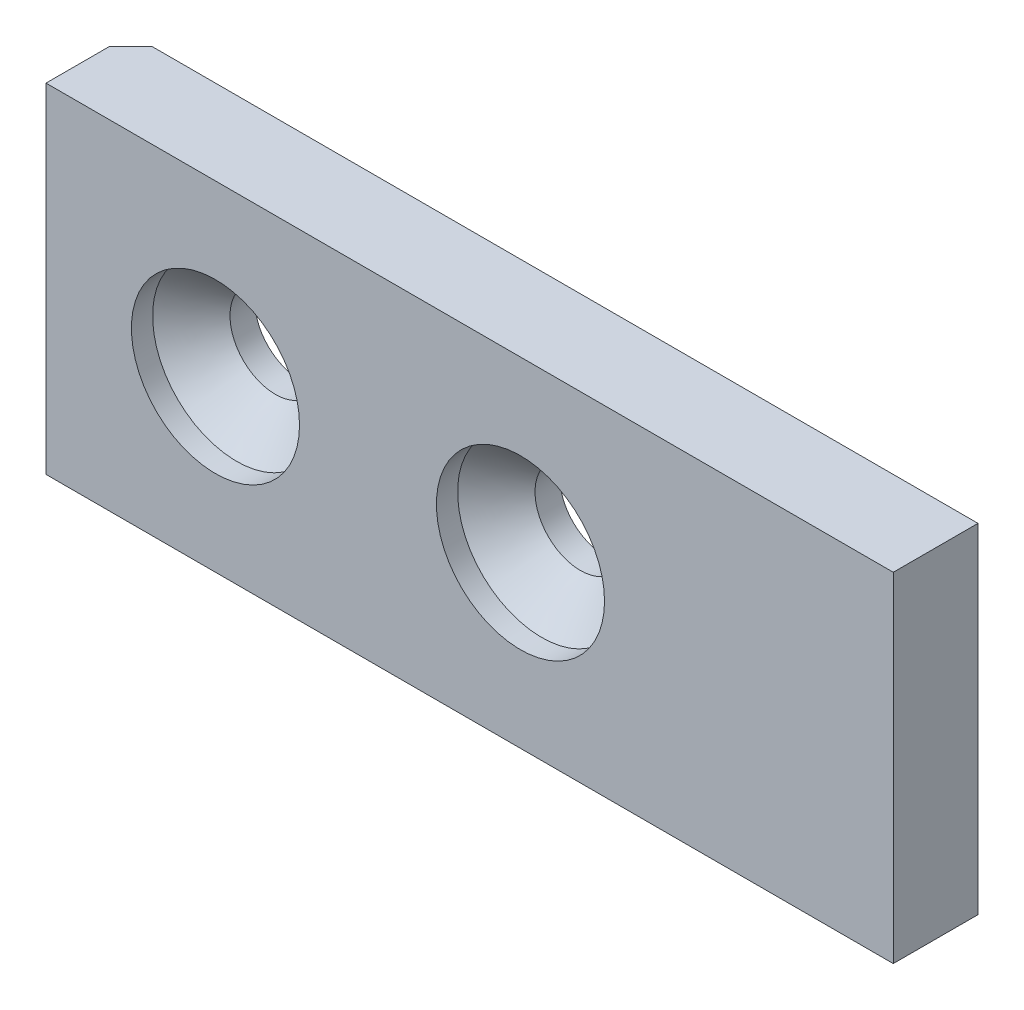
ISO-10303-21;
HEADER;
FILE_DESCRIPTION(('STEP AP214'),'2;1');
FILE_NAME('part.step','',(''),(''),'','','');
FILE_SCHEMA(('AUTOMOTIVE_DESIGN { 1 0 10303 214 1 1 1 1 }'));
ENDSEC;
DATA;
#1=APPLICATION_CONTEXT('core data for automotive mechanical design processes');
#2=APPLICATION_PROTOCOL_DEFINITION('international standard','automotive_design',2000,#1);
#3=PRODUCT_CONTEXT('',#1,'mechanical');
#4=PRODUCT('Part','Part','',(#3));
#5=PRODUCT_RELATED_PRODUCT_CATEGORY('part','',(#4));
#6=PRODUCT_DEFINITION_FORMATION('','',#4);
#7=PRODUCT_DEFINITION_CONTEXT('part definition',#1,'design');
#8=PRODUCT_DEFINITION('design','',#6,#7);
#9=PRODUCT_DEFINITION_SHAPE('','',#8);
#10=(LENGTH_UNIT() NAMED_UNIT(*) SI_UNIT(.MILLI.,.METRE.));
#11=(NAMED_UNIT(*) PLANE_ANGLE_UNIT() SI_UNIT($,.RADIAN.));
#12=(NAMED_UNIT(*) SI_UNIT($,.STERADIAN.) SOLID_ANGLE_UNIT());
#13=UNCERTAINTY_MEASURE_WITH_UNIT(LENGTH_MEASURE(1.E-05),#10,'distance_accuracy_value','');
#14=(GEOMETRIC_REPRESENTATION_CONTEXT(3) GLOBAL_UNCERTAINTY_ASSIGNED_CONTEXT((#13)) GLOBAL_UNIT_ASSIGNED_CONTEXT((#10,
#11,#12)) REPRESENTATION_CONTEXT('',''));
#15=CARTESIAN_POINT('',(0.,0.,0.));
#16=DIRECTION('',(0.,0.,1.));
#17=DIRECTION('',(1.,0.,0.));
#18=AXIS2_PLACEMENT_3D('',#15,#16,#17);
#19=CARTESIAN_POINT('',(-15.8750000000003,6.35,3.17500000000004));
#20=DIRECTION('',(1.,0.,0.));
#21=DIRECTION('',(0.,0.,-1.));
#22=AXIS2_PLACEMENT_3D('',#19,#20,#21);
#23=PLANE('',#22);
#24=DIRECTION('',(0.,0.707106781186548,0.707106781186547));
#25=VECTOR('',#24,1.);
#26=CARTESIAN_POINT('',(-15.8750000000003,7.540625,1.98437500000004));
#27=LINE('',#26,#25);
#28=CARTESIAN_POINT('',(-15.8750000000003,5.55625,0.));
#29=VERTEX_POINT('',#28);
#30=CARTESIAN_POINT('',(-15.8750000000003,6.35,0.793750000000037));
#31=VERTEX_POINT('',#30);
#32=EDGE_CURVE('E113',#29,#31,#27,.T.);
#33=ORIENTED_EDGE('',*,*,#32,.F.);
#34=DIRECTION('',(0.,-1.,0.));
#35=VECTOR('',#34,1.);
#36=CARTESIAN_POINT('',(-15.8750000000003,6.35,0.));
#37=LINE('',#36,#35);
#38=CARTESIAN_POINT('',(-15.8750000000003,-6.35,0.));
#39=VERTEX_POINT('',#38);
#40=EDGE_CURVE('E102',#29,#39,#37,.T.);
#41=ORIENTED_EDGE('',*,*,#40,.T.);
#42=DIRECTION('',(0.,0.,-1.));
#43=VECTOR('',#42,1.);
#44=CARTESIAN_POINT('',(-15.8750000000003,-6.35,3.17500000000004));
#45=LINE('',#44,#43);
#46=CARTESIAN_POINT('',(-15.8750000000003,-6.35,3.17500000000004));
#47=VERTEX_POINT('',#46);
#48=EDGE_CURVE('E117',#47,#39,#45,.T.);
#49=ORIENTED_EDGE('',*,*,#48,.F.);
#50=DIRECTION('',(0.,-1.,0.));
#51=VECTOR('',#50,1.);
#52=CARTESIAN_POINT('',(-15.8750000000003,6.35,3.17500000000004));
#53=LINE('',#52,#51);
#54=CARTESIAN_POINT('',(-15.8750000000003,6.35,3.17500000000004));
#55=VERTEX_POINT('',#54);
#56=EDGE_CURVE('E132',#55,#47,#53,.T.);
#57=ORIENTED_EDGE('',*,*,#56,.F.);
#58=DIRECTION('',(0.,0.,-1.));
#59=VECTOR('',#58,1.);
#60=CARTESIAN_POINT('',(-15.8750000000003,6.35,3.17500000000004));
#61=LINE('',#60,#59);
#62=EDGE_CURVE('E115',#55,#31,#61,.T.);
#63=ORIENTED_EDGE('',*,*,#62,.T.);
#64=EDGE_LOOP('',(#33,#41,#49,#57,#63));
#65=FACE_BOUND('',#64,.T.);
#66=ADVANCED_FACE('F59',(#65),#23,.F.);
#67=CARTESIAN_POINT('',(-15.8750000000003,-6.35,3.17500000000004));
#68=DIRECTION('',(0.,1.,0.));
#69=DIRECTION('',(0.,0.,1.));
#70=AXIS2_PLACEMENT_3D('',#67,#68,#69);
#71=PLANE('',#70);
#72=DIRECTION('',(1.,0.,0.));
#73=VECTOR('',#72,1.);
#74=CARTESIAN_POINT('',(-15.8750000000003,-6.35,0.));
#75=LINE('',#74,#73);
#76=CARTESIAN_POINT('',(15.8750000000003,-6.35,0.));
#77=VERTEX_POINT('',#76);
#78=EDGE_CURVE('E106',#39,#77,#75,.T.);
#79=ORIENTED_EDGE('',*,*,#78,.T.);
#80=DIRECTION('',(0.,0.,-1.));
#81=VECTOR('',#80,1.);
#82=CARTESIAN_POINT('',(15.8750000000003,-6.35,3.17500000000004));
#83=LINE('',#82,#81);
#84=CARTESIAN_POINT('',(15.8750000000003,-6.35,3.17500000000004));
#85=VERTEX_POINT('',#84);
#86=EDGE_CURVE('E122',#85,#77,#83,.T.);
#87=ORIENTED_EDGE('',*,*,#86,.F.);
#88=DIRECTION('',(1.,0.,0.));
#89=VECTOR('',#88,1.);
#90=CARTESIAN_POINT('',(-15.8750000000003,-6.35,3.17500000000004));
#91=LINE('',#90,#89);
#92=EDGE_CURVE('E139',#47,#85,#91,.T.);
#93=ORIENTED_EDGE('',*,*,#92,.F.);
#94=ORIENTED_EDGE('',*,*,#48,.T.);
#95=EDGE_LOOP('',(#79,#87,#93,#94));
#96=FACE_BOUND('',#95,.T.);
#97=ADVANCED_FACE('F179',(#96),#71,.F.);
#98=CARTESIAN_POINT('',(15.8750000000003,6.35,3.17500000000004));
#99=DIRECTION('',(-1.,0.,0.));
#100=DIRECTION('',(0.,0.,1.));
#101=AXIS2_PLACEMENT_3D('',#98,#99,#100);
#102=PLANE('',#101);
#103=DIRECTION('',(0.,1.,0.));
#104=VECTOR('',#103,1.);
#105=CARTESIAN_POINT('',(15.8750000000003,6.35,0.));
#106=LINE('',#105,#104);
#107=CARTESIAN_POINT('',(15.8750000000003,6.35,0.));
#108=VERTEX_POINT('',#107);
#109=EDGE_CURVE('E133',#77,#108,#106,.T.);
#110=ORIENTED_EDGE('',*,*,#109,.T.);
#111=DIRECTION('',(0.,0.,-1.));
#112=VECTOR('',#111,1.);
#113=CARTESIAN_POINT('',(15.8750000000003,6.35,3.17500000000004));
#114=LINE('',#113,#112);
#115=CARTESIAN_POINT('',(15.8750000000003,6.35,3.17500000000004));
#116=VERTEX_POINT('',#115);
#117=EDGE_CURVE('E125',#116,#108,#114,.T.);
#118=ORIENTED_EDGE('',*,*,#117,.F.);
#119=DIRECTION('',(0.,1.,0.));
#120=VECTOR('',#119,1.);
#121=CARTESIAN_POINT('',(15.8750000000003,6.35,3.17500000000004));
#122=LINE('',#121,#120);
#123=EDGE_CURVE('E137',#85,#116,#122,.T.);
#124=ORIENTED_EDGE('',*,*,#123,.F.);
#125=ORIENTED_EDGE('',*,*,#86,.T.);
#126=EDGE_LOOP('',(#110,#118,#124,#125));
#127=FACE_BOUND('',#126,.T.);
#128=ADVANCED_FACE('F183',(#127),#102,.F.);
#129=CARTESIAN_POINT('',(-15.8750000000003,6.35,3.17500000000004));
#130=DIRECTION('',(0.,-1.,0.));
#131=DIRECTION('',(0.,0.,-1.));
#132=AXIS2_PLACEMENT_3D('',#129,#130,#131);
#133=PLANE('',#132);
#134=DIRECTION('',(0.707106781186547,0.,-0.707106781186548));
#135=VECTOR('',#134,1.);
#136=CARTESIAN_POINT('',(-17.0656249999999,6.35,1.98437500000004));
#137=LINE('',#136,#135);
#138=CARTESIAN_POINT('',(-15.0812499999997,6.35,0.));
#139=VERTEX_POINT('',#138);
#140=EDGE_CURVE('E66',#31,#139,#137,.T.);
#141=ORIENTED_EDGE('',*,*,#140,.F.);
#142=ORIENTED_EDGE('',*,*,#62,.F.);
#143=DIRECTION('',(-1.,0.,0.));
#144=VECTOR('',#143,1.);
#145=CARTESIAN_POINT('',(-15.8750000000003,6.35,3.17500000000004));
#146=LINE('',#145,#144);
#147=EDGE_CURVE('E129',#116,#55,#146,.T.);
#148=ORIENTED_EDGE('',*,*,#147,.F.);
#149=ORIENTED_EDGE('',*,*,#117,.T.);
#150=DIRECTION('',(-1.,0.,0.));
#151=VECTOR('',#150,1.);
#152=CARTESIAN_POINT('',(-15.8750000000003,6.35,0.));
#153=LINE('',#152,#151);
#154=EDGE_CURVE('E130',#108,#139,#153,.T.);
#155=ORIENTED_EDGE('',*,*,#154,.T.);
#156=EDGE_LOOP('',(#141,#142,#148,#149,#155));
#157=FACE_BOUND('',#156,.T.);
#158=ADVANCED_FACE('F172',(#157),#133,.F.);
#159=CARTESIAN_POINT('',(0.,0.,3.17500000000004));
#160=DIRECTION('',(0.,0.,1.));
#161=DIRECTION('',(1.,0.,0.));
#162=AXIS2_PLACEMENT_3D('',#159,#160,#161);
#163=PLANE('',#162);
#164=CARTESIAN_POINT('',(-9.52500000000001,0.,3.17500000000004));
#165=DIRECTION('',(0.,0.,1.));
#166=DIRECTION('',(1.,0.,0.));
#167=AXIS2_PLACEMENT_3D('',#164,#165,#166);
#168=CIRCLE('',#167,3.15);
#169=CARTESIAN_POINT('',(-6.37500000000001,0.,3.17500000000004));
#170=VERTEX_POINT('',#169);
#171=EDGE_CURVE('E163',#170,#170,#168,.T.);
#172=ORIENTED_EDGE('',*,*,#171,.F.);
#173=EDGE_LOOP('',(#172));
#174=FACE_BOUND('',#173,.T.);
#175=CARTESIAN_POINT('',(1.90499999999982,0.,3.17500000000004));
#176=DIRECTION('',(0.,0.,1.));
#177=DIRECTION('',(1.,0.,0.));
#178=AXIS2_PLACEMENT_3D('',#175,#176,#177);
#179=CIRCLE('',#178,3.15);
#180=CARTESIAN_POINT('',(5.05499999999982,0.,3.17500000000004));
#181=VERTEX_POINT('',#180);
#182=EDGE_CURVE('E151',#181,#181,#179,.T.);
#183=ORIENTED_EDGE('',*,*,#182,.F.);
#184=EDGE_LOOP('',(#183));
#185=FACE_BOUND('',#184,.T.);
#186=ORIENTED_EDGE('',*,*,#56,.T.);
#187=ORIENTED_EDGE('',*,*,#92,.T.);
#188=ORIENTED_EDGE('',*,*,#123,.T.);
#189=ORIENTED_EDGE('',*,*,#147,.T.);
#190=EDGE_LOOP('',(#186,#187,#188,#189));
#191=FACE_BOUND('',#190,.T.);
#192=ADVANCED_FACE('F169',(#174,#185,#191),#163,.T.);
#193=CARTESIAN_POINT('',(0.,0.,0.));
#194=DIRECTION('',(0.,0.,1.));
#195=DIRECTION('',(1.,0.,0.));
#196=AXIS2_PLACEMENT_3D('',#193,#194,#195);
#197=PLANE('',#196);
#198=CARTESIAN_POINT('',(-9.52500000000001,0.,0.));
#199=DIRECTION('',(0.,0.,1.));
#200=DIRECTION('',(1.,0.,0.));
#201=AXIS2_PLACEMENT_3D('',#198,#199,#200);
#202=CIRCLE('',#201,1.70000000000001);
#203=CARTESIAN_POINT('',(-7.82499999999999,0.,0.));
#204=VERTEX_POINT('',#203);
#205=EDGE_CURVE('E154',#204,#204,#202,.T.);
#206=ORIENTED_EDGE('',*,*,#205,.T.);
#207=EDGE_LOOP('',(#206));
#208=FACE_BOUND('',#207,.T.);
#209=CARTESIAN_POINT('',(1.90499999999982,0.,0.));
#210=DIRECTION('',(0.,0.,1.));
#211=DIRECTION('',(1.,0.,0.));
#212=AXIS2_PLACEMENT_3D('',#209,#210,#211);
#213=CIRCLE('',#212,1.70000000000001);
#214=CARTESIAN_POINT('',(3.60499999999984,0.,0.));
#215=VERTEX_POINT('',#214);
#216=EDGE_CURVE('E110',#215,#215,#213,.T.);
#217=ORIENTED_EDGE('',*,*,#216,.T.);
#218=EDGE_LOOP('',(#217));
#219=FACE_BOUND('',#218,.T.);
#220=DIRECTION('',(-0.707106781186547,-0.707106781186548,0.));
#221=VECTOR('',#220,1.);
#222=CARTESIAN_POINT('',(-10.7156250000005,10.715625,0.));
#223=LINE('',#222,#221);
#224=EDGE_CURVE('E14',#139,#29,#223,.T.);
#225=ORIENTED_EDGE('',*,*,#224,.F.);
#226=ORIENTED_EDGE('',*,*,#154,.F.);
#227=ORIENTED_EDGE('',*,*,#109,.F.);
#228=ORIENTED_EDGE('',*,*,#78,.F.);
#229=ORIENTED_EDGE('',*,*,#40,.F.);
#230=EDGE_LOOP('',(#225,#226,#227,#228,#229));
#231=FACE_BOUND('',#230,.T.);
#232=ADVANCED_FACE('F104',(#208,#219,#231),#197,.F.);
#233=CARTESIAN_POINT('',(-7.14375,7.14375,-7.14375));
#234=DIRECTION('',(-0.577350269189627,0.577350269189625,-0.577350269189626));
#235=DIRECTION('',(-0.707106781186547,0.,0.707106781186548));
#236=AXIS2_PLACEMENT_3D('',#233,#234,#235);
#237=PLANE('',#236);
#238=ORIENTED_EDGE('',*,*,#224,.T.);
#239=ORIENTED_EDGE('',*,*,#32,.T.);
#240=ORIENTED_EDGE('',*,*,#140,.T.);
#241=EDGE_LOOP('',(#238,#239,#240));
#242=FACE_BOUND('',#241,.T.);
#243=ADVANCED_FACE('F119',(#242),#237,.T.);
#244=CARTESIAN_POINT('',(1.90499999999982,0.,3.17500000000004));
#245=DIRECTION('',(0.,0.,1.));
#246=DIRECTION('',(1.,0.,0.));
#247=AXIS2_PLACEMENT_3D('',#244,#245,#246);
#248=CYLINDRICAL_SURFACE('',#247,1.70000000000001);
#249=ORIENTED_EDGE('',*,*,#216,.F.);
#250=EDGE_LOOP('',(#249));
#251=FACE_BOUND('',#250,.T.);
#252=CARTESIAN_POINT('',(1.90499999999982,0.,0.929979999999997));
#253=DIRECTION('',(0.,0.,1.));
#254=DIRECTION('',(1.,0.,0.));
#255=AXIS2_PLACEMENT_3D('',#252,#253,#254);
#256=CIRCLE('',#255,1.7);
#257=CARTESIAN_POINT('',(3.60499999999982,0.,0.929979999999997));
#258=VERTEX_POINT('',#257);
#259=EDGE_CURVE('E145',#258,#258,#256,.T.);
#260=ORIENTED_EDGE('',*,*,#259,.T.);
#261=EDGE_LOOP('',(#260));
#262=FACE_BOUND('',#261,.T.);
#263=ADVANCED_FACE('F222',(#251,#262),#248,.F.);
#264=CARTESIAN_POINT('',(1.90499999999982,0.,2.37997999999995));
#265=DIRECTION('',(0.,0.,1.));
#266=DIRECTION('',(1.,0.,0.));
#267=AXIS2_PLACEMENT_3D('',#264,#265,#266);
#268=CONICAL_SURFACE('',#267,3.15,0.785398163397449);
#269=ORIENTED_EDGE('',*,*,#259,.F.);
#270=EDGE_LOOP('',(#269));
#271=FACE_BOUND('',#270,.T.);
#272=CARTESIAN_POINT('',(1.90499999999982,0.,2.37997999999995));
#273=DIRECTION('',(0.,0.,1.));
#274=DIRECTION('',(1.,0.,0.));
#275=AXIS2_PLACEMENT_3D('',#272,#273,#274);
#276=CIRCLE('',#275,3.15);
#277=CARTESIAN_POINT('',(5.05499999999982,0.,2.37997999999995));
#278=VERTEX_POINT('',#277);
#279=EDGE_CURVE('E148',#278,#278,#276,.T.);
#280=ORIENTED_EDGE('',*,*,#279,.T.);
#281=EDGE_LOOP('',(#280));
#282=FACE_BOUND('',#281,.T.);
#283=ADVANCED_FACE('F229',(#271,#282),#268,.F.);
#284=CARTESIAN_POINT('',(1.90499999999982,0.,3.17500000000004));
#285=DIRECTION('',(0.,0.,1.));
#286=DIRECTION('',(1.,0.,0.));
#287=AXIS2_PLACEMENT_3D('',#284,#285,#286);
#288=CYLINDRICAL_SURFACE('',#287,3.15);
#289=ORIENTED_EDGE('',*,*,#279,.F.);
#290=EDGE_LOOP('',(#289));
#291=FACE_BOUND('',#290,.T.);
#292=ORIENTED_EDGE('',*,*,#182,.T.);
#293=EDGE_LOOP('',(#292));
#294=FACE_BOUND('',#293,.T.);
#295=ADVANCED_FACE('F237',(#291,#294),#288,.F.);
#296=CARTESIAN_POINT('',(-9.52500000000001,0.,3.17500000000004));
#297=DIRECTION('',(0.,0.,1.));
#298=DIRECTION('',(1.,0.,0.));
#299=AXIS2_PLACEMENT_3D('',#296,#297,#298);
#300=CYLINDRICAL_SURFACE('',#299,1.70000000000001);
#301=ORIENTED_EDGE('',*,*,#205,.F.);
#302=EDGE_LOOP('',(#301));
#303=FACE_BOUND('',#302,.T.);
#304=CARTESIAN_POINT('',(-9.52500000000001,0.,0.929979999999997));
#305=DIRECTION('',(0.,0.,1.));
#306=DIRECTION('',(1.,0.,0.));
#307=AXIS2_PLACEMENT_3D('',#304,#305,#306);
#308=CIRCLE('',#307,1.7);
#309=CARTESIAN_POINT('',(-7.82500000000001,0.,0.929979999999997));
#310=VERTEX_POINT('',#309);
#311=EDGE_CURVE('E157',#310,#310,#308,.T.);
#312=ORIENTED_EDGE('',*,*,#311,.T.);
#313=EDGE_LOOP('',(#312));
#314=FACE_BOUND('',#313,.T.);
#315=ADVANCED_FACE('F245',(#303,#314),#300,.F.);
#316=CARTESIAN_POINT('',(-9.52500000000001,0.,2.37997999999995));
#317=DIRECTION('',(0.,0.,1.));
#318=DIRECTION('',(1.,0.,0.));
#319=AXIS2_PLACEMENT_3D('',#316,#317,#318);
#320=CONICAL_SURFACE('',#319,3.15,0.785398163397449);
#321=ORIENTED_EDGE('',*,*,#311,.F.);
#322=EDGE_LOOP('',(#321));
#323=FACE_BOUND('',#322,.T.);
#324=CARTESIAN_POINT('',(-9.52500000000001,0.,2.37997999999995));
#325=DIRECTION('',(0.,0.,1.));
#326=DIRECTION('',(1.,0.,0.));
#327=AXIS2_PLACEMENT_3D('',#324,#325,#326);
#328=CIRCLE('',#327,3.15);
#329=CARTESIAN_POINT('',(-6.37500000000001,0.,2.37997999999995));
#330=VERTEX_POINT('',#329);
#331=EDGE_CURVE('E160',#330,#330,#328,.T.);
#332=ORIENTED_EDGE('',*,*,#331,.T.);
#333=EDGE_LOOP('',(#332));
#334=FACE_BOUND('',#333,.T.);
#335=ADVANCED_FACE('F254',(#323,#334),#320,.F.);
#336=CARTESIAN_POINT('',(-9.52500000000001,0.,3.17500000000004));
#337=DIRECTION('',(0.,0.,1.));
#338=DIRECTION('',(1.,0.,0.));
#339=AXIS2_PLACEMENT_3D('',#336,#337,#338);
#340=CYLINDRICAL_SURFACE('',#339,3.15);
#341=ORIENTED_EDGE('',*,*,#331,.F.);
#342=EDGE_LOOP('',(#341));
#343=FACE_BOUND('',#342,.T.);
#344=ORIENTED_EDGE('',*,*,#171,.T.);
#345=EDGE_LOOP('',(#344));
#346=FACE_BOUND('',#345,.T.);
#347=ADVANCED_FACE('F167',(#343,#346),#340,.F.);
#348=CLOSED_SHELL('',(#66,#97,#128,#158,#192,#232,#243,#263,#283,#295,#315,#335,#347));
#349=MANIFOLD_SOLID_BREP('B2',#348);
#350=ADVANCED_BREP_SHAPE_REPRESENTATION('',(#18,#349),#14);
#351=SHAPE_DEFINITION_REPRESENTATION(#9,#350);
ENDSEC;
END-ISO-10303-21;
